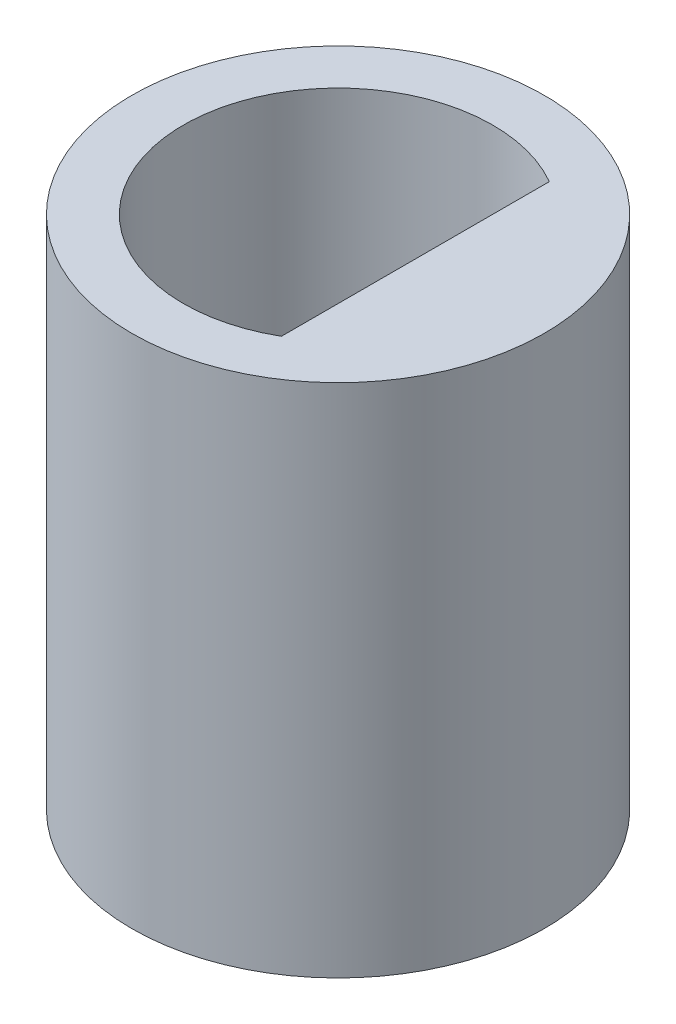
ISO-10303-21;
HEADER;
FILE_DESCRIPTION(('STEP AP214'),'2;1');
FILE_NAME('part.step','',(''),(''),'','','');
FILE_SCHEMA(('AUTOMOTIVE_DESIGN { 1 0 10303 214 1 1 1 1 }'));
ENDSEC;
DATA;
#1=APPLICATION_CONTEXT('core data for automotive mechanical design processes');
#2=APPLICATION_PROTOCOL_DEFINITION('international standard','automotive_design',2000,#1);
#3=PRODUCT_CONTEXT('',#1,'mechanical');
#4=PRODUCT('Part','Part','',(#3));
#5=PRODUCT_RELATED_PRODUCT_CATEGORY('part','',(#4));
#6=PRODUCT_DEFINITION_FORMATION('','',#4);
#7=PRODUCT_DEFINITION_CONTEXT('part definition',#1,'design');
#8=PRODUCT_DEFINITION('design','',#6,#7);
#9=PRODUCT_DEFINITION_SHAPE('','',#8);
#10=(LENGTH_UNIT() NAMED_UNIT(*) SI_UNIT(.MILLI.,.METRE.));
#11=(NAMED_UNIT(*) PLANE_ANGLE_UNIT() SI_UNIT($,.RADIAN.));
#12=(NAMED_UNIT(*) SI_UNIT($,.STERADIAN.) SOLID_ANGLE_UNIT());
#13=UNCERTAINTY_MEASURE_WITH_UNIT(LENGTH_MEASURE(1.E-05),#10,'distance_accuracy_value','');
#14=(GEOMETRIC_REPRESENTATION_CONTEXT(3) GLOBAL_UNCERTAINTY_ASSIGNED_CONTEXT((#13)) GLOBAL_UNIT_ASSIGNED_CONTEXT((#10,
#11,#12)) REPRESENTATION_CONTEXT('',''));
#15=CARTESIAN_POINT('',(0.,0.,0.));
#16=DIRECTION('',(0.,0.,1.));
#17=DIRECTION('',(1.,0.,0.));
#18=AXIS2_PLACEMENT_3D('',#15,#16,#17);
#19=CARTESIAN_POINT('',(0.,10.,0.));
#20=DIRECTION('',(0.,1.,0.));
#21=DIRECTION('',(0.,0.,1.));
#22=AXIS2_PLACEMENT_3D('',#19,#20,#21);
#23=PLANE('',#22);
#24=CARTESIAN_POINT('',(0.,10.,0.));
#25=DIRECTION('',(0.,1.,0.));
#26=DIRECTION('',(0.,0.,1.));
#27=AXIS2_PLACEMENT_3D('',#24,#25,#26);
#28=CIRCLE('',#27,4.);
#29=CARTESIAN_POINT('',(0.,10.,4.));
#30=VERTEX_POINT('',#29);
#31=EDGE_CURVE('E11',#30,#30,#28,.T.);
#32=ORIENTED_EDGE('',*,*,#31,.T.);
#33=EDGE_LOOP('',(#32));
#34=FACE_BOUND('',#33,.T.);
#35=DIRECTION('',(0.,0.,-1.));
#36=VECTOR('',#35,1.);
#37=CARTESIAN_POINT('',(1.5,10.,-2.59807621135332));
#38=LINE('',#37,#36);
#39=CARTESIAN_POINT('',(1.5,10.,2.59807621135332));
#40=VERTEX_POINT('',#39);
#41=CARTESIAN_POINT('',(1.5,10.,-2.59807621135332));
#42=VERTEX_POINT('',#41);
#43=EDGE_CURVE('E88',#40,#42,#38,.T.);
#44=ORIENTED_EDGE('',*,*,#43,.F.);
#45=CARTESIAN_POINT('',(0.,10.,0.));
#46=DIRECTION('',(0.,1.,0.));
#47=DIRECTION('',(0.,0.,1.));
#48=AXIS2_PLACEMENT_3D('',#45,#46,#47);
#49=CIRCLE('',#48,3.);
#50=EDGE_CURVE('E77',#42,#40,#49,.T.);
#51=ORIENTED_EDGE('',*,*,#50,.F.);
#52=EDGE_LOOP('',(#44,#51));
#53=FACE_BOUND('',#52,.T.);
#54=ADVANCED_FACE('F43',(#34,#53),#23,.T.);
#55=CARTESIAN_POINT('',(0.,0.,0.));
#56=DIRECTION('',(0.,1.,0.));
#57=DIRECTION('',(0.,0.,1.));
#58=AXIS2_PLACEMENT_3D('',#55,#56,#57);
#59=PLANE('',#58);
#60=CARTESIAN_POINT('',(0.,0.,0.));
#61=DIRECTION('',(0.,1.,0.));
#62=DIRECTION('',(0.,0.,1.));
#63=AXIS2_PLACEMENT_3D('',#60,#61,#62);
#64=CIRCLE('',#63,4.);
#65=CARTESIAN_POINT('',(0.,0.,4.));
#66=VERTEX_POINT('',#65);
#67=EDGE_CURVE('E47',#66,#66,#64,.T.);
#68=ORIENTED_EDGE('',*,*,#67,.F.);
#69=EDGE_LOOP('',(#68));
#70=FACE_BOUND('',#69,.T.);
#71=CARTESIAN_POINT('',(0.,0.,0.));
#72=DIRECTION('',(0.,1.,0.));
#73=DIRECTION('',(0.,0.,1.));
#74=AXIS2_PLACEMENT_3D('',#71,#72,#73);
#75=CIRCLE('',#74,3.);
#76=CARTESIAN_POINT('',(1.5,0.,-2.59807621135332));
#77=VERTEX_POINT('',#76);
#78=CARTESIAN_POINT('',(1.5,0.,2.59807621135332));
#79=VERTEX_POINT('',#78);
#80=EDGE_CURVE('E66',#77,#79,#75,.T.);
#81=ORIENTED_EDGE('',*,*,#80,.T.);
#82=DIRECTION('',(0.,0.,-1.));
#83=VECTOR('',#82,1.);
#84=CARTESIAN_POINT('',(1.5,0.,-2.59807621135332));
#85=LINE('',#84,#83);
#86=EDGE_CURVE('E72',#79,#77,#85,.T.);
#87=ORIENTED_EDGE('',*,*,#86,.T.);
#88=EDGE_LOOP('',(#81,#87));
#89=FACE_BOUND('',#88,.T.);
#90=ADVANCED_FACE('F84',(#70,#89),#59,.F.);
#91=CARTESIAN_POINT('',(0.,10.,0.));
#92=DIRECTION('',(0.,-1.,0.));
#93=DIRECTION('',(0.,0.,-1.));
#94=AXIS2_PLACEMENT_3D('',#91,#92,#93);
#95=CYLINDRICAL_SURFACE('',#94,4.);
#96=ORIENTED_EDGE('',*,*,#31,.F.);
#97=EDGE_LOOP('',(#96));
#98=FACE_BOUND('',#97,.T.);
#99=ORIENTED_EDGE('',*,*,#67,.T.);
#100=EDGE_LOOP('',(#99));
#101=FACE_BOUND('',#100,.T.);
#102=ADVANCED_FACE('F45',(#98,#101),#95,.T.);
#103=CARTESIAN_POINT('',(0.,10.,0.));
#104=DIRECTION('',(0.,-1.,0.));
#105=DIRECTION('',(0.,0.,-1.));
#106=AXIS2_PLACEMENT_3D('',#103,#104,#105);
#107=CYLINDRICAL_SURFACE('',#106,3.);
#108=ORIENTED_EDGE('',*,*,#80,.F.);
#109=DIRECTION('',(0.,-1.,0.));
#110=VECTOR('',#109,1.);
#111=CARTESIAN_POINT('',(1.5,10.,-2.59807621135332));
#112=LINE('',#111,#110);
#113=EDGE_CURVE('E74',#42,#77,#112,.T.);
#114=ORIENTED_EDGE('',*,*,#113,.F.);
#115=ORIENTED_EDGE('',*,*,#50,.T.);
#116=DIRECTION('',(0.,-1.,0.));
#117=VECTOR('',#116,1.);
#118=CARTESIAN_POINT('',(1.5,10.,2.59807621135332));
#119=LINE('',#118,#117);
#120=EDGE_CURVE('E59',#40,#79,#119,.T.);
#121=ORIENTED_EDGE('',*,*,#120,.T.);
#122=EDGE_LOOP('',(#108,#114,#115,#121));
#123=FACE_BOUND('',#122,.T.);
#124=ADVANCED_FACE('F79',(#123),#107,.F.);
#125=CARTESIAN_POINT('',(1.5,10.,-2.59807621135332));
#126=DIRECTION('',(-1.,0.,0.));
#127=DIRECTION('',(0.,0.,1.));
#128=AXIS2_PLACEMENT_3D('',#125,#126,#127);
#129=PLANE('',#128);
#130=ORIENTED_EDGE('',*,*,#86,.F.);
#131=ORIENTED_EDGE('',*,*,#120,.F.);
#132=ORIENTED_EDGE('',*,*,#43,.T.);
#133=ORIENTED_EDGE('',*,*,#113,.T.);
#134=EDGE_LOOP('',(#130,#131,#132,#133));
#135=FACE_BOUND('',#134,.T.);
#136=ADVANCED_FACE('F73',(#135),#129,.T.);
#137=CLOSED_SHELL('',(#54,#90,#102,#124,#136));
#138=MANIFOLD_SOLID_BREP('B2',#137);
#139=ADVANCED_BREP_SHAPE_REPRESENTATION('',(#18,#138),#14);
#140=SHAPE_DEFINITION_REPRESENTATION(#9,#139);
ENDSEC;
END-ISO-10303-21;
